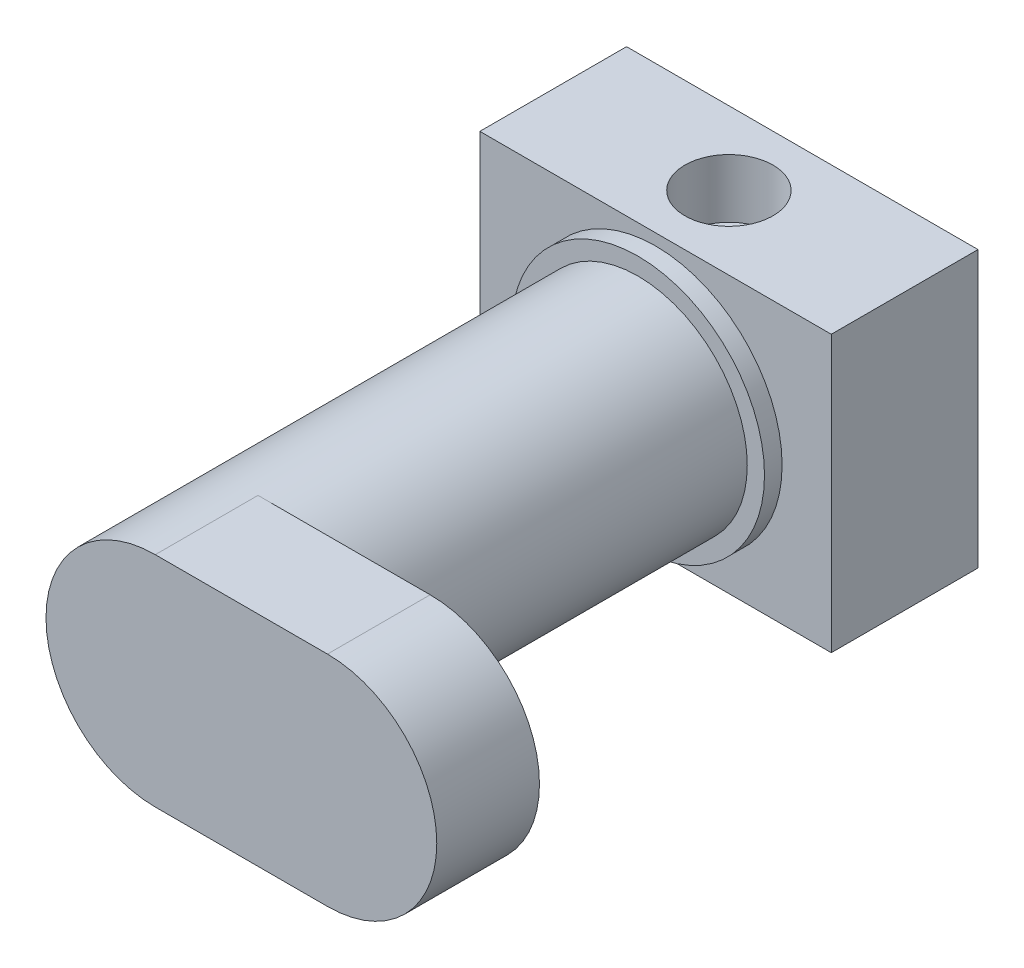
ISO-10303-21;
HEADER;
FILE_DESCRIPTION(('STEP AP214'),'2;1');
FILE_NAME('part.step','',(''),(''),'','','');
FILE_SCHEMA(('AUTOMOTIVE_DESIGN { 1 0 10303 214 1 1 1 1 }'));
ENDSEC;
DATA;
#1=APPLICATION_CONTEXT('core data for automotive mechanical design processes');
#2=APPLICATION_PROTOCOL_DEFINITION('international standard','automotive_design',2000,#1);
#3=PRODUCT_CONTEXT('',#1,'mechanical');
#4=PRODUCT('Part','Part','',(#3));
#5=PRODUCT_RELATED_PRODUCT_CATEGORY('part','',(#4));
#6=PRODUCT_DEFINITION_FORMATION('','',#4);
#7=PRODUCT_DEFINITION_CONTEXT('part definition',#1,'design');
#8=PRODUCT_DEFINITION('design','',#6,#7);
#9=PRODUCT_DEFINITION_SHAPE('','',#8);
#10=(LENGTH_UNIT() NAMED_UNIT(*) SI_UNIT(.MILLI.,.METRE.));
#11=(NAMED_UNIT(*) PLANE_ANGLE_UNIT() SI_UNIT($,.RADIAN.));
#12=(NAMED_UNIT(*) SI_UNIT($,.STERADIAN.) SOLID_ANGLE_UNIT());
#13=UNCERTAINTY_MEASURE_WITH_UNIT(LENGTH_MEASURE(1.E-05),#10,'distance_accuracy_value','');
#14=(GEOMETRIC_REPRESENTATION_CONTEXT(3) GLOBAL_UNCERTAINTY_ASSIGNED_CONTEXT((#13)) GLOBAL_UNIT_ASSIGNED_CONTEXT((#10,
#11,#12)) REPRESENTATION_CONTEXT('',''));
#15=CARTESIAN_POINT('',(0.,0.,0.));
#16=DIRECTION('',(0.,0.,1.));
#17=DIRECTION('',(1.,0.,0.));
#18=AXIS2_PLACEMENT_3D('',#15,#16,#17);
#19=CARTESIAN_POINT('',(0.,0.,22.4));
#20=DIRECTION('',(0.,0.,-1.));
#21=DIRECTION('',(-1.,0.,0.));
#22=AXIS2_PLACEMENT_3D('',#19,#20,#21);
#23=CYLINDRICAL_SURFACE('',#22,17.25);
#24=CARTESIAN_POINT('',(0.,0.,22.4));
#25=DIRECTION('',(0.,0.,1.));
#26=DIRECTION('',(1.,0.,0.));
#27=AXIS2_PLACEMENT_3D('',#24,#25,#26);
#28=CIRCLE('',#27,17.25);
#29=CARTESIAN_POINT('',(17.25,0.,22.4));
#30=VERTEX_POINT('',#29);
#31=EDGE_CURVE('E285',#30,#30,#28,.T.);
#32=ORIENTED_EDGE('',*,*,#31,.F.);
#33=EDGE_LOOP('',(#32));
#34=FACE_BOUND('',#33,.T.);
#35=CARTESIAN_POINT('',(0.,0.,20.));
#36=DIRECTION('',(0.,0.,-1.));
#37=DIRECTION('',(-1.,0.,0.));
#38=AXIS2_PLACEMENT_3D('',#35,#36,#37);
#39=CIRCLE('',#38,17.25);
#40=CARTESIAN_POINT('',(-17.25,0.,20.));
#41=VERTEX_POINT('',#40);
#42=EDGE_CURVE('E11',#41,#41,#39,.T.);
#43=ORIENTED_EDGE('',*,*,#42,.F.);
#44=EDGE_LOOP('',(#43));
#45=FACE_BOUND('',#44,.T.);
#46=ADVANCED_FACE('F37',(#34,#45),#23,.T.);
#47=CARTESIAN_POINT('',(0.,0.,22.4));
#48=DIRECTION('',(0.,0.,1.));
#49=DIRECTION('',(1.,0.,0.));
#50=AXIS2_PLACEMENT_3D('',#47,#48,#49);
#51=PLANE('',#50);
#52=CARTESIAN_POINT('',(0.,0.,22.4));
#53=DIRECTION('',(0.,0.,1.));
#54=DIRECTION('',(1.,0.,0.));
#55=AXIS2_PLACEMENT_3D('',#52,#53,#54);
#56=CIRCLE('',#55,14.9);
#57=CARTESIAN_POINT('',(14.9,0.,22.4));
#58=VERTEX_POINT('',#57);
#59=EDGE_CURVE('E44',#58,#58,#56,.T.);
#60=ORIENTED_EDGE('',*,*,#59,.F.);
#61=EDGE_LOOP('',(#60));
#62=FACE_BOUND('',#61,.T.);
#63=ORIENTED_EDGE('',*,*,#31,.T.);
#64=EDGE_LOOP('',(#63));
#65=FACE_BOUND('',#64,.T.);
#66=ADVANCED_FACE('F290',(#62,#65),#51,.T.);
#67=CARTESIAN_POINT('',(0.,0.,60.8));
#68=DIRECTION('',(0.,0.,-1.));
#69=DIRECTION('',(-1.,0.,0.));
#70=AXIS2_PLACEMENT_3D('',#67,#68,#69);
#71=CYLINDRICAL_SURFACE('',#70,14.9);
#72=ORIENTED_EDGE('',*,*,#59,.T.);
#73=EDGE_LOOP('',(#72));
#74=FACE_BOUND('',#73,.T.);
#75=CARTESIAN_POINT('',(0.,0.,74.2));
#76=DIRECTION('',(0.,0.,1.));
#77=DIRECTION('',(1.,0.,0.));
#78=AXIS2_PLACEMENT_3D('',#75,#76,#77);
#79=CIRCLE('',#78,14.9);
#80=CARTESIAN_POINT('',(0.,-14.9,74.2));
#81=VERTEX_POINT('',#80);
#82=CARTESIAN_POINT('',(0.,14.9,74.2));
#83=VERTEX_POINT('',#82);
#84=EDGE_CURVE('E283',#81,#83,#79,.T.);
#85=ORIENTED_EDGE('',*,*,#84,.F.);
#86=DIRECTION('',(0.,0.,-1.));
#87=VECTOR('',#86,1.);
#88=CARTESIAN_POINT('',(0.,-14.9,88.2));
#89=LINE('',#88,#87);
#90=CARTESIAN_POINT('',(0.,-14.9,88.2));
#91=VERTEX_POINT('',#90);
#92=EDGE_CURVE('E280',#91,#81,#89,.T.);
#93=ORIENTED_EDGE('',*,*,#92,.F.);
#94=CARTESIAN_POINT('',(0.,0.,88.2));
#95=DIRECTION('',(0.,0.,1.));
#96=DIRECTION('',(1.,0.,0.));
#97=AXIS2_PLACEMENT_3D('',#94,#95,#96);
#98=CIRCLE('',#97,14.9);
#99=CARTESIAN_POINT('',(0.,14.9,88.2));
#100=VERTEX_POINT('',#99);
#101=EDGE_CURVE('E256',#100,#91,#98,.T.);
#102=ORIENTED_EDGE('',*,*,#101,.F.);
#103=DIRECTION('',(0.,0.,-1.));
#104=VECTOR('',#103,1.);
#105=CARTESIAN_POINT('',(0.,14.9,88.2));
#106=LINE('',#105,#104);
#107=EDGE_CURVE('E266',#100,#83,#106,.T.);
#108=ORIENTED_EDGE('',*,*,#107,.T.);
#109=EDGE_LOOP('',(#85,#93,#102,#108));
#110=FACE_BOUND('',#109,.T.);
#111=ADVANCED_FACE('F368',(#74,#110),#71,.T.);
#112=CARTESIAN_POINT('',(0.,0.,74.2));
#113=DIRECTION('',(0.,0.,1.));
#114=DIRECTION('',(1.,0.,0.));
#115=AXIS2_PLACEMENT_3D('',#112,#113,#114);
#116=PLANE('',#115);
#117=DIRECTION('',(1.,0.,0.));
#118=VECTOR('',#117,1.);
#119=CARTESIAN_POINT('',(23.4724923544397,-14.9,74.2));
#120=LINE('',#119,#118);
#121=CARTESIAN_POINT('',(23.4724923544397,-14.9,74.2));
#122=VERTEX_POINT('',#121);
#123=EDGE_CURVE('E255',#81,#122,#120,.T.);
#124=ORIENTED_EDGE('',*,*,#123,.F.);
#125=ORIENTED_EDGE('',*,*,#84,.T.);
#126=DIRECTION('',(-1.,0.,0.));
#127=VECTOR('',#126,1.);
#128=CARTESIAN_POINT('',(0.,14.9,74.2));
#129=LINE('',#128,#127);
#130=CARTESIAN_POINT('',(23.4724923544397,14.9,74.2));
#131=VERTEX_POINT('',#130);
#132=EDGE_CURVE('E260',#131,#83,#129,.T.);
#133=ORIENTED_EDGE('',*,*,#132,.F.);
#134=CARTESIAN_POINT('',(23.4724923544397,0.,74.2));
#135=DIRECTION('',(0.,0.,1.));
#136=DIRECTION('',(-1.,0.,0.));
#137=AXIS2_PLACEMENT_3D('',#134,#135,#136);
#138=CIRCLE('',#137,14.9);
#139=EDGE_CURVE('E268',#122,#131,#138,.T.);
#140=ORIENTED_EDGE('',*,*,#139,.F.);
#141=EDGE_LOOP('',(#124,#125,#133,#140));
#142=FACE_BOUND('',#141,.T.);
#143=ADVANCED_FACE('F364',(#142),#116,.F.);
#144=CARTESIAN_POINT('',(23.4724923544397,-14.9,88.2));
#145=DIRECTION('',(0.,1.,0.));
#146=DIRECTION('',(0.,0.,1.));
#147=AXIS2_PLACEMENT_3D('',#144,#145,#146);
#148=PLANE('',#147);
#149=ORIENTED_EDGE('',*,*,#123,.T.);
#150=DIRECTION('',(0.,0.,-1.));
#151=VECTOR('',#150,1.);
#152=CARTESIAN_POINT('',(23.4724923544397,-14.9,88.2));
#153=LINE('',#152,#151);
#154=CARTESIAN_POINT('',(23.4724923544397,-14.9,88.2));
#155=VERTEX_POINT('',#154);
#156=EDGE_CURVE('E277',#155,#122,#153,.T.);
#157=ORIENTED_EDGE('',*,*,#156,.F.);
#158=DIRECTION('',(1.,0.,0.));
#159=VECTOR('',#158,1.);
#160=CARTESIAN_POINT('',(23.4724923544397,-14.9,88.2));
#161=LINE('',#160,#159);
#162=EDGE_CURVE('E259',#91,#155,#161,.T.);
#163=ORIENTED_EDGE('',*,*,#162,.F.);
#164=ORIENTED_EDGE('',*,*,#92,.T.);
#165=EDGE_LOOP('',(#149,#157,#163,#164));
#166=FACE_BOUND('',#165,.T.);
#167=ADVANCED_FACE('F367',(#166),#148,.F.);
#168=CARTESIAN_POINT('',(23.4724923544397,0.,88.2));
#169=DIRECTION('',(0.,0.,-1.));
#170=DIRECTION('',(-1.,0.,0.));
#171=AXIS2_PLACEMENT_3D('',#168,#169,#170);
#172=CYLINDRICAL_SURFACE('',#171,14.9);
#173=ORIENTED_EDGE('',*,*,#139,.T.);
#174=DIRECTION('',(0.,0.,-1.));
#175=VECTOR('',#174,1.);
#176=CARTESIAN_POINT('',(23.4724923544397,14.9,88.2));
#177=LINE('',#176,#175);
#178=CARTESIAN_POINT('',(23.4724923544397,14.9,88.2));
#179=VERTEX_POINT('',#178);
#180=EDGE_CURVE('E274',#179,#131,#177,.T.);
#181=ORIENTED_EDGE('',*,*,#180,.F.);
#182=CARTESIAN_POINT('',(23.4724923544397,0.,88.2));
#183=DIRECTION('',(0.,0.,1.));
#184=DIRECTION('',(-1.,0.,0.));
#185=AXIS2_PLACEMENT_3D('',#182,#183,#184);
#186=CIRCLE('',#185,14.9);
#187=EDGE_CURVE('E262',#155,#179,#186,.T.);
#188=ORIENTED_EDGE('',*,*,#187,.F.);
#189=ORIENTED_EDGE('',*,*,#156,.T.);
#190=EDGE_LOOP('',(#173,#181,#188,#189));
#191=FACE_BOUND('',#190,.T.);
#192=ADVANCED_FACE('F372',(#191),#172,.T.);
#193=CARTESIAN_POINT('',(0.,14.9,88.2));
#194=DIRECTION('',(0.,-1.,0.));
#195=DIRECTION('',(0.,0.,-1.));
#196=AXIS2_PLACEMENT_3D('',#193,#194,#195);
#197=PLANE('',#196);
#198=ORIENTED_EDGE('',*,*,#132,.T.);
#199=ORIENTED_EDGE('',*,*,#107,.F.);
#200=DIRECTION('',(-1.,0.,0.));
#201=VECTOR('',#200,1.);
#202=CARTESIAN_POINT('',(0.,14.9,88.2));
#203=LINE('',#202,#201);
#204=EDGE_CURVE('E264',#179,#100,#203,.T.);
#205=ORIENTED_EDGE('',*,*,#204,.F.);
#206=ORIENTED_EDGE('',*,*,#180,.T.);
#207=EDGE_LOOP('',(#198,#199,#205,#206));
#208=FACE_BOUND('',#207,.T.);
#209=ADVANCED_FACE('F362',(#208),#197,.F.);
#210=CARTESIAN_POINT('',(0.,0.,88.2));
#211=DIRECTION('',(0.,0.,1.));
#212=DIRECTION('',(1.,0.,0.));
#213=AXIS2_PLACEMENT_3D('',#210,#211,#212);
#214=PLANE('',#213);
#215=ORIENTED_EDGE('',*,*,#101,.T.);
#216=ORIENTED_EDGE('',*,*,#162,.T.);
#217=ORIENTED_EDGE('',*,*,#187,.T.);
#218=ORIENTED_EDGE('',*,*,#204,.T.);
#219=EDGE_LOOP('',(#215,#216,#217,#218));
#220=FACE_BOUND('',#219,.T.);
#221=ADVANCED_FACE('F323',(#220),#214,.T.);
#222=CARTESIAN_POINT('',(23.9554551394132,-18.799716307342,20.));
#223=DIRECTION('',(1.,0.,0.));
#224=DIRECTION('',(0.,0.,-1.));
#225=AXIS2_PLACEMENT_3D('',#222,#223,#224);
#226=PLANE('',#225);
#227=DIRECTION('',(0.,-1.,0.));
#228=VECTOR('',#227,1.);
#229=CARTESIAN_POINT('',(23.9554551394132,-18.799716307342,0.));
#230=LINE('',#229,#228);
#231=CARTESIAN_POINT('',(23.9554551394132,18.799716307342,0.));
#232=VERTEX_POINT('',#231);
#233=CARTESIAN_POINT('',(23.9554551394132,-18.799716307342,0.));
#234=VERTEX_POINT('',#233);
#235=EDGE_CURVE('E185',#232,#234,#230,.T.);
#236=ORIENTED_EDGE('',*,*,#235,.F.);
#237=DIRECTION('',(0.,0.,-1.));
#238=VECTOR('',#237,1.);
#239=CARTESIAN_POINT('',(23.9554551394132,18.799716307342,20.));
#240=LINE('',#239,#238);
#241=CARTESIAN_POINT('',(23.9554551394132,18.799716307342,20.));
#242=VERTEX_POINT('',#241);
#243=EDGE_CURVE('E173',#242,#232,#240,.T.);
#244=ORIENTED_EDGE('',*,*,#243,.F.);
#245=DIRECTION('',(0.,-1.,0.));
#246=VECTOR('',#245,1.);
#247=CARTESIAN_POINT('',(23.9554551394132,-18.799716307342,20.));
#248=LINE('',#247,#246);
#249=CARTESIAN_POINT('',(23.9554551394132,-18.799716307342,20.));
#250=VERTEX_POINT('',#249);
#251=EDGE_CURVE('E167',#242,#250,#248,.T.);
#252=ORIENTED_EDGE('',*,*,#251,.T.);
#253=DIRECTION('',(0.,0.,-1.));
#254=VECTOR('',#253,1.);
#255=CARTESIAN_POINT('',(23.9554551394132,-18.799716307342,20.));
#256=LINE('',#255,#254);
#257=EDGE_CURVE('E149',#250,#234,#256,.T.);
#258=ORIENTED_EDGE('',*,*,#257,.T.);
#259=EDGE_LOOP('',(#236,#244,#252,#258));
#260=FACE_BOUND('',#259,.T.);
#261=ADVANCED_FACE('F172',(#260),#226,.T.);
#262=CARTESIAN_POINT('',(-23.9554551394132,18.799716307342,20.));
#263=DIRECTION('',(0.,1.,0.));
#264=DIRECTION('',(-1.,0.,0.));
#265=AXIS2_PLACEMENT_3D('',#262,#263,#264);
#266=PLANE('',#265);
#267=CARTESIAN_POINT('',(0.,18.799716307342,10.));
#268=DIRECTION('',(0.,-1.,0.));
#269=DIRECTION('',(0.,0.,-1.));
#270=AXIS2_PLACEMENT_3D('',#267,#268,#269);
#271=CIRCLE('',#270,6.);
#272=CARTESIAN_POINT('',(0.,18.799716307342,4.));
#273=VERTEX_POINT('',#272);
#274=EDGE_CURVE('E406',#273,#273,#271,.T.);
#275=ORIENTED_EDGE('',*,*,#274,.T.);
#276=EDGE_LOOP('',(#275));
#277=FACE_BOUND('',#276,.T.);
#278=DIRECTION('',(1.,0.,0.));
#279=VECTOR('',#278,1.);
#280=CARTESIAN_POINT('',(-23.9554551394132,18.799716307342,0.));
#281=LINE('',#280,#279);
#282=CARTESIAN_POINT('',(-23.9554551394132,18.799716307342,0.));
#283=VERTEX_POINT('',#282);
#284=EDGE_CURVE('E174',#283,#232,#281,.T.);
#285=ORIENTED_EDGE('',*,*,#284,.F.);
#286=DIRECTION('',(0.,0.,-1.));
#287=VECTOR('',#286,1.);
#288=CARTESIAN_POINT('',(-23.9554551394132,18.799716307342,20.));
#289=LINE('',#288,#287);
#290=CARTESIAN_POINT('',(-23.9554551394132,18.799716307342,20.));
#291=VERTEX_POINT('',#290);
#292=EDGE_CURVE('E192',#291,#283,#289,.T.);
#293=ORIENTED_EDGE('',*,*,#292,.F.);
#294=DIRECTION('',(1.,0.,0.));
#295=VECTOR('',#294,1.);
#296=CARTESIAN_POINT('',(-23.9554551394132,18.799716307342,20.));
#297=LINE('',#296,#295);
#298=EDGE_CURVE('E160',#291,#242,#297,.T.);
#299=ORIENTED_EDGE('',*,*,#298,.T.);
#300=ORIENTED_EDGE('',*,*,#243,.T.);
#301=EDGE_LOOP('',(#285,#293,#299,#300));
#302=FACE_BOUND('',#301,.T.);
#303=ADVANCED_FACE('F315',(#277,#302),#266,.T.);
#304=CARTESIAN_POINT('',(-23.9554551394132,-18.799716307342,20.));
#305=DIRECTION('',(-1.,0.,0.));
#306=DIRECTION('',(0.,0.,1.));
#307=AXIS2_PLACEMENT_3D('',#304,#305,#306);
#308=PLANE('',#307);
#309=DIRECTION('',(0.,1.,0.));
#310=VECTOR('',#309,1.);
#311=CARTESIAN_POINT('',(-23.9554551394132,-18.799716307342,0.));
#312=LINE('',#311,#310);
#313=CARTESIAN_POINT('',(-23.9554551394132,-18.799716307342,0.));
#314=VERTEX_POINT('',#313);
#315=EDGE_CURVE('E177',#314,#283,#312,.T.);
#316=ORIENTED_EDGE('',*,*,#315,.F.);
#317=DIRECTION('',(0.,0.,-1.));
#318=VECTOR('',#317,1.);
#319=CARTESIAN_POINT('',(-23.9554551394132,-18.799716307342,20.));
#320=LINE('',#319,#318);
#321=CARTESIAN_POINT('',(-23.9554551394132,-18.799716307342,20.));
#322=VERTEX_POINT('',#321);
#323=EDGE_CURVE('E159',#322,#314,#320,.T.);
#324=ORIENTED_EDGE('',*,*,#323,.F.);
#325=DIRECTION('',(0.,1.,0.));
#326=VECTOR('',#325,1.);
#327=CARTESIAN_POINT('',(-23.9554551394132,-18.799716307342,20.));
#328=LINE('',#327,#326);
#329=EDGE_CURVE('E170',#322,#291,#328,.T.);
#330=ORIENTED_EDGE('',*,*,#329,.T.);
#331=ORIENTED_EDGE('',*,*,#292,.T.);
#332=EDGE_LOOP('',(#316,#324,#330,#331));
#333=FACE_BOUND('',#332,.T.);
#334=ADVANCED_FACE('F308',(#333),#308,.T.);
#335=CARTESIAN_POINT('',(-23.9554551394132,-18.799716307342,20.));
#336=DIRECTION('',(0.,-1.,0.));
#337=DIRECTION('',(0.,0.,-1.));
#338=AXIS2_PLACEMENT_3D('',#335,#336,#337);
#339=PLANE('',#338);
#340=CARTESIAN_POINT('',(0.,-18.799716307342,10.));
#341=DIRECTION('',(0.,-1.,0.));
#342=DIRECTION('',(0.,0.,-1.));
#343=AXIS2_PLACEMENT_3D('',#340,#341,#342);
#344=CIRCLE('',#343,6.);
#345=CARTESIAN_POINT('',(0.,-18.799716307342,4.));
#346=VERTEX_POINT('',#345);
#347=EDGE_CURVE('E180',#346,#346,#344,.T.);
#348=ORIENTED_EDGE('',*,*,#347,.F.);
#349=EDGE_LOOP('',(#348));
#350=FACE_BOUND('',#349,.T.);
#351=DIRECTION('',(-1.,0.,0.));
#352=VECTOR('',#351,1.);
#353=CARTESIAN_POINT('',(-23.9554551394132,-18.799716307342,0.));
#354=LINE('',#353,#352);
#355=EDGE_CURVE('E154',#234,#314,#354,.T.);
#356=ORIENTED_EDGE('',*,*,#355,.F.);
#357=ORIENTED_EDGE('',*,*,#257,.F.);
#358=DIRECTION('',(-1.,0.,0.));
#359=VECTOR('',#358,1.);
#360=CARTESIAN_POINT('',(-23.9554551394132,-18.799716307342,20.));
#361=LINE('',#360,#359);
#362=EDGE_CURVE('E152',#250,#322,#361,.T.);
#363=ORIENTED_EDGE('',*,*,#362,.T.);
#364=ORIENTED_EDGE('',*,*,#323,.T.);
#365=EDGE_LOOP('',(#356,#357,#363,#364));
#366=FACE_BOUND('',#365,.T.);
#367=ADVANCED_FACE('F151',(#350,#366),#339,.T.);
#368=CARTESIAN_POINT('',(0.,0.,20.));
#369=DIRECTION('',(0.,0.,-1.));
#370=DIRECTION('',(-1.,0.,0.));
#371=AXIS2_PLACEMENT_3D('',#368,#369,#370);
#372=PLANE('',#371);
#373=ORIENTED_EDGE('',*,*,#42,.T.);
#374=EDGE_LOOP('',(#373));
#375=FACE_BOUND('',#374,.T.);
#376=ORIENTED_EDGE('',*,*,#251,.F.);
#377=ORIENTED_EDGE('',*,*,#298,.F.);
#378=ORIENTED_EDGE('',*,*,#329,.F.);
#379=ORIENTED_EDGE('',*,*,#362,.F.);
#380=EDGE_LOOP('',(#376,#377,#378,#379));
#381=FACE_BOUND('',#380,.T.);
#382=ADVANCED_FACE('F165',(#375,#381),#372,.F.);
#383=CARTESIAN_POINT('',(0.,0.,-8.));
#384=DIRECTION('',(0.,0.,-1.));
#385=DIRECTION('',(-1.,0.,0.));
#386=AXIS2_PLACEMENT_3D('',#383,#384,#385);
#387=PLANE('',#386);
#388=DIRECTION('',(0.,-1.,0.));
#389=VECTOR('',#388,1.);
#390=CARTESIAN_POINT('',(1.5,-5.,-8.));
#391=LINE('',#390,#389);
#392=CARTESIAN_POINT('',(1.5,5.,-8.));
#393=VERTEX_POINT('',#392);
#394=CARTESIAN_POINT('',(1.5,-5.,-8.));
#395=VERTEX_POINT('',#394);
#396=EDGE_CURVE('E195',#393,#395,#391,.T.);
#397=ORIENTED_EDGE('',*,*,#396,.T.);
#398=DIRECTION('',(-1.,0.,0.));
#399=VECTOR('',#398,1.);
#400=CARTESIAN_POINT('',(-1.5,-5.,-8.));
#401=LINE('',#400,#399);
#402=CARTESIAN_POINT('',(-1.5,-5.,-8.));
#403=VERTEX_POINT('',#402);
#404=EDGE_CURVE('E198',#395,#403,#401,.T.);
#405=ORIENTED_EDGE('',*,*,#404,.T.);
#406=DIRECTION('',(0.,1.,0.));
#407=VECTOR('',#406,1.);
#408=CARTESIAN_POINT('',(-1.5,-5.,-8.));
#409=LINE('',#408,#407);
#410=CARTESIAN_POINT('',(-1.5,5.,-8.));
#411=VERTEX_POINT('',#410);
#412=EDGE_CURVE('E202',#403,#411,#409,.T.);
#413=ORIENTED_EDGE('',*,*,#412,.T.);
#414=DIRECTION('',(1.,0.,0.));
#415=VECTOR('',#414,1.);
#416=CARTESIAN_POINT('',(-1.5,5.,-8.));
#417=LINE('',#416,#415);
#418=EDGE_CURVE('E205',#411,#393,#417,.T.);
#419=ORIENTED_EDGE('',*,*,#418,.T.);
#420=EDGE_LOOP('',(#397,#405,#413,#419));
#421=FACE_BOUND('',#420,.T.);
#422=ADVANCED_FACE('F297',(#421),#387,.T.);
#423=CARTESIAN_POINT('',(-1.5,-5.,-8.));
#424=DIRECTION('',(0.,-1.,0.));
#425=DIRECTION('',(0.,0.,-1.));
#426=AXIS2_PLACEMENT_3D('',#423,#424,#425);
#427=PLANE('',#426);
#428=DIRECTION('',(-1.,0.,0.));
#429=VECTOR('',#428,1.);
#430=CARTESIAN_POINT('',(-1.5,-5.,-10.));
#431=LINE('',#430,#429);
#432=CARTESIAN_POINT('',(1.5,-5.,-10.));
#433=VERTEX_POINT('',#432);
#434=CARTESIAN_POINT('',(-1.5,-5.,-10.));
#435=VERTEX_POINT('',#434);
#436=EDGE_CURVE('E210',#433,#435,#431,.T.);
#437=ORIENTED_EDGE('',*,*,#436,.T.);
#438=DIRECTION('',(0.,0.,-1.));
#439=VECTOR('',#438,1.);
#440=CARTESIAN_POINT('',(-1.5,-5.,-8.));
#441=LINE('',#440,#439);
#442=EDGE_CURVE('E222',#403,#435,#441,.T.);
#443=ORIENTED_EDGE('',*,*,#442,.F.);
#444=ORIENTED_EDGE('',*,*,#404,.F.);
#445=DIRECTION('',(0.,0.,-1.));
#446=VECTOR('',#445,1.);
#447=CARTESIAN_POINT('',(1.5,-5.,-8.));
#448=LINE('',#447,#446);
#449=EDGE_CURVE('E208',#395,#433,#448,.T.);
#450=ORIENTED_EDGE('',*,*,#449,.T.);
#451=EDGE_LOOP('',(#437,#443,#444,#450));
#452=FACE_BOUND('',#451,.T.);
#453=ADVANCED_FACE('F304',(#452),#427,.F.);
#454=CARTESIAN_POINT('',(-1.5,-5.,-8.));
#455=DIRECTION('',(-1.,0.,0.));
#456=DIRECTION('',(0.,0.,1.));
#457=AXIS2_PLACEMENT_3D('',#454,#455,#456);
#458=PLANE('',#457);
#459=DIRECTION('',(0.,1.,0.));
#460=VECTOR('',#459,1.);
#461=CARTESIAN_POINT('',(-1.5,-5.,-10.));
#462=LINE('',#461,#460);
#463=CARTESIAN_POINT('',(-1.5,5.,-10.));
#464=VERTEX_POINT('',#463);
#465=EDGE_CURVE('E213',#435,#464,#462,.T.);
#466=ORIENTED_EDGE('',*,*,#465,.T.);
#467=DIRECTION('',(0.,0.,-1.));
#468=VECTOR('',#467,1.);
#469=CARTESIAN_POINT('',(-1.5,5.,-8.));
#470=LINE('',#469,#468);
#471=EDGE_CURVE('E220',#411,#464,#470,.T.);
#472=ORIENTED_EDGE('',*,*,#471,.F.);
#473=ORIENTED_EDGE('',*,*,#412,.F.);
#474=ORIENTED_EDGE('',*,*,#442,.T.);
#475=EDGE_LOOP('',(#466,#472,#473,#474));
#476=FACE_BOUND('',#475,.T.);
#477=ADVANCED_FACE('F329',(#476),#458,.F.);
#478=CARTESIAN_POINT('',(-1.5,5.,-8.));
#479=DIRECTION('',(0.,1.,0.));
#480=DIRECTION('',(0.,0.,1.));
#481=AXIS2_PLACEMENT_3D('',#478,#479,#480);
#482=PLANE('',#481);
#483=DIRECTION('',(1.,0.,0.));
#484=VECTOR('',#483,1.);
#485=CARTESIAN_POINT('',(-1.5,5.,-10.));
#486=LINE('',#485,#484);
#487=CARTESIAN_POINT('',(1.5,5.,-10.));
#488=VERTEX_POINT('',#487);
#489=EDGE_CURVE('E199',#464,#488,#486,.T.);
#490=ORIENTED_EDGE('',*,*,#489,.T.);
#491=DIRECTION('',(0.,0.,-1.));
#492=VECTOR('',#491,1.);
#493=CARTESIAN_POINT('',(1.5,5.,-8.));
#494=LINE('',#493,#492);
#495=EDGE_CURVE('E218',#393,#488,#494,.T.);
#496=ORIENTED_EDGE('',*,*,#495,.F.);
#497=ORIENTED_EDGE('',*,*,#418,.F.);
#498=ORIENTED_EDGE('',*,*,#471,.T.);
#499=EDGE_LOOP('',(#490,#496,#497,#498));
#500=FACE_BOUND('',#499,.T.);
#501=ADVANCED_FACE('F325',(#500),#482,.F.);
#502=CARTESIAN_POINT('',(1.5,-5.,-8.));
#503=DIRECTION('',(1.,0.,0.));
#504=DIRECTION('',(0.,1.,0.));
#505=AXIS2_PLACEMENT_3D('',#502,#503,#504);
#506=PLANE('',#505);
#507=DIRECTION('',(0.,-1.,0.));
#508=VECTOR('',#507,1.);
#509=CARTESIAN_POINT('',(1.5,-5.,-10.));
#510=LINE('',#509,#508);
#511=EDGE_CURVE('E51',#488,#433,#510,.T.);
#512=ORIENTED_EDGE('',*,*,#511,.T.);
#513=ORIENTED_EDGE('',*,*,#449,.F.);
#514=ORIENTED_EDGE('',*,*,#396,.F.);
#515=ORIENTED_EDGE('',*,*,#495,.T.);
#516=EDGE_LOOP('',(#512,#513,#514,#515));
#517=FACE_BOUND('',#516,.T.);
#518=ADVANCED_FACE('F328',(#517),#506,.F.);
#519=CARTESIAN_POINT('',(0.,0.,-10.));
#520=DIRECTION('',(0.,0.,-1.));
#521=DIRECTION('',(-1.,0.,0.));
#522=AXIS2_PLACEMENT_3D('',#519,#520,#521);
#523=PLANE('',#522);
#524=ORIENTED_EDGE('',*,*,#511,.F.);
#525=ORIENTED_EDGE('',*,*,#489,.F.);
#526=ORIENTED_EDGE('',*,*,#465,.F.);
#527=ORIENTED_EDGE('',*,*,#436,.F.);
#528=EDGE_LOOP('',(#524,#525,#526,#527));
#529=FACE_BOUND('',#528,.T.);
#530=DIRECTION('',(0.,-1.,0.));
#531=VECTOR('',#530,1.);
#532=CARTESIAN_POINT('',(4.,-6.,-10.));
#533=LINE('',#532,#531);
#534=CARTESIAN_POINT('',(4.,6.,-10.));
#535=VERTEX_POINT('',#534);
#536=CARTESIAN_POINT('',(4.,-6.,-10.));
#537=VERTEX_POINT('',#536);
#538=EDGE_CURVE('E225',#535,#537,#533,.T.);
#539=ORIENTED_EDGE('',*,*,#538,.T.);
#540=DIRECTION('',(-1.,0.,0.));
#541=VECTOR('',#540,1.);
#542=CARTESIAN_POINT('',(-4.,-6.,-10.));
#543=LINE('',#542,#541);
#544=CARTESIAN_POINT('',(-4.,-6.,-10.));
#545=VERTEX_POINT('',#544);
#546=EDGE_CURVE('E228',#537,#545,#543,.T.);
#547=ORIENTED_EDGE('',*,*,#546,.T.);
#548=DIRECTION('',(0.,1.,0.));
#549=VECTOR('',#548,1.);
#550=CARTESIAN_POINT('',(-4.,-6.,-10.));
#551=LINE('',#550,#549);
#552=CARTESIAN_POINT('',(-4.,6.,-10.));
#553=VERTEX_POINT('',#552);
#554=EDGE_CURVE('E231',#545,#553,#551,.T.);
#555=ORIENTED_EDGE('',*,*,#554,.T.);
#556=DIRECTION('',(1.,0.,0.));
#557=VECTOR('',#556,1.);
#558=CARTESIAN_POINT('',(-4.,6.,-10.));
#559=LINE('',#558,#557);
#560=EDGE_CURVE('E233',#553,#535,#559,.T.);
#561=ORIENTED_EDGE('',*,*,#560,.T.);
#562=EDGE_LOOP('',(#539,#547,#555,#561));
#563=FACE_BOUND('',#562,.T.);
#564=ADVANCED_FACE('F339',(#529,#563),#523,.T.);
#565=CARTESIAN_POINT('',(-4.,-6.,-10.));
#566=DIRECTION('',(0.,1.,0.));
#567=DIRECTION('',(-1.,0.,0.));
#568=AXIS2_PLACEMENT_3D('',#565,#566,#567);
#569=PLANE('',#568);
#570=DIRECTION('',(-1.,0.,0.));
#571=VECTOR('',#570,1.);
#572=CARTESIAN_POINT('',(-4.,-6.,0.));
#573=LINE('',#572,#571);
#574=CARTESIAN_POINT('',(4.,-6.,0.));
#575=VERTEX_POINT('',#574);
#576=CARTESIAN_POINT('',(-4.,-6.,0.));
#577=VERTEX_POINT('',#576);
#578=EDGE_CURVE('E237',#575,#577,#573,.T.);
#579=ORIENTED_EDGE('',*,*,#578,.T.);
#580=DIRECTION('',(0.,0.,1.));
#581=VECTOR('',#580,1.);
#582=CARTESIAN_POINT('',(-4.,-6.,-10.));
#583=LINE('',#582,#581);
#584=EDGE_CURVE('E249',#545,#577,#583,.T.);
#585=ORIENTED_EDGE('',*,*,#584,.F.);
#586=ORIENTED_EDGE('',*,*,#546,.F.);
#587=DIRECTION('',(0.,0.,1.));
#588=VECTOR('',#587,1.);
#589=CARTESIAN_POINT('',(4.,-6.,-10.));
#590=LINE('',#589,#588);
#591=EDGE_CURVE('E252',#537,#575,#590,.T.);
#592=ORIENTED_EDGE('',*,*,#591,.T.);
#593=EDGE_LOOP('',(#579,#585,#586,#592));
#594=FACE_BOUND('',#593,.T.);
#595=ADVANCED_FACE('F342',(#594),#569,.F.);
#596=CARTESIAN_POINT('',(-4.,-6.,-10.));
#597=DIRECTION('',(1.,0.,0.));
#598=DIRECTION('',(0.,0.,-1.));
#599=AXIS2_PLACEMENT_3D('',#596,#597,#598);
#600=PLANE('',#599);
#601=DIRECTION('',(0.,1.,0.));
#602=VECTOR('',#601,1.);
#603=CARTESIAN_POINT('',(-4.,-6.,0.));
#604=LINE('',#603,#602);
#605=CARTESIAN_POINT('',(-4.,6.,0.));
#606=VERTEX_POINT('',#605);
#607=EDGE_CURVE('E240',#577,#606,#604,.T.);
#608=ORIENTED_EDGE('',*,*,#607,.T.);
#609=DIRECTION('',(0.,0.,1.));
#610=VECTOR('',#609,1.);
#611=CARTESIAN_POINT('',(-4.,6.,-10.));
#612=LINE('',#611,#610);
#613=EDGE_CURVE('E246',#553,#606,#612,.T.);
#614=ORIENTED_EDGE('',*,*,#613,.F.);
#615=ORIENTED_EDGE('',*,*,#554,.F.);
#616=ORIENTED_EDGE('',*,*,#584,.T.);
#617=EDGE_LOOP('',(#608,#614,#615,#616));
#618=FACE_BOUND('',#617,.T.);
#619=ADVANCED_FACE('F348',(#618),#600,.F.);
#620=CARTESIAN_POINT('',(-4.,6.,-10.));
#621=DIRECTION('',(0.,-1.,0.));
#622=DIRECTION('',(0.,0.,-1.));
#623=AXIS2_PLACEMENT_3D('',#620,#621,#622);
#624=PLANE('',#623);
#625=DIRECTION('',(1.,0.,0.));
#626=VECTOR('',#625,1.);
#627=CARTESIAN_POINT('',(-4.,6.,0.));
#628=LINE('',#627,#626);
#629=CARTESIAN_POINT('',(4.,6.,0.));
#630=VERTEX_POINT('',#629);
#631=EDGE_CURVE('E229',#606,#630,#628,.T.);
#632=ORIENTED_EDGE('',*,*,#631,.T.);
#633=DIRECTION('',(0.,0.,1.));
#634=VECTOR('',#633,1.);
#635=CARTESIAN_POINT('',(4.,6.,-10.));
#636=LINE('',#635,#634);
#637=EDGE_CURVE('E235',#535,#630,#636,.T.);
#638=ORIENTED_EDGE('',*,*,#637,.F.);
#639=ORIENTED_EDGE('',*,*,#560,.F.);
#640=ORIENTED_EDGE('',*,*,#613,.T.);
#641=EDGE_LOOP('',(#632,#638,#639,#640));
#642=FACE_BOUND('',#641,.T.);
#643=ADVANCED_FACE('F344',(#642),#624,.F.);
#644=CARTESIAN_POINT('',(4.,-6.,-10.));
#645=DIRECTION('',(-1.,0.,0.));
#646=DIRECTION('',(0.,0.,1.));
#647=AXIS2_PLACEMENT_3D('',#644,#645,#646);
#648=PLANE('',#647);
#649=DIRECTION('',(0.,-1.,0.));
#650=VECTOR('',#649,1.);
#651=CARTESIAN_POINT('',(4.,-6.,0.));
#652=LINE('',#651,#650);
#653=EDGE_CURVE('E59',#630,#575,#652,.T.);
#654=ORIENTED_EDGE('',*,*,#653,.T.);
#655=ORIENTED_EDGE('',*,*,#591,.F.);
#656=ORIENTED_EDGE('',*,*,#538,.F.);
#657=ORIENTED_EDGE('',*,*,#637,.T.);
#658=EDGE_LOOP('',(#654,#655,#656,#657));
#659=FACE_BOUND('',#658,.T.);
#660=ADVANCED_FACE('F347',(#659),#648,.F.);
#661=CARTESIAN_POINT('',(0.,0.,0.));
#662=DIRECTION('',(0.,0.,1.));
#663=DIRECTION('',(1.,0.,0.));
#664=AXIS2_PLACEMENT_3D('',#661,#662,#663);
#665=PLANE('',#664);
#666=ORIENTED_EDGE('',*,*,#653,.F.);
#667=ORIENTED_EDGE('',*,*,#631,.F.);
#668=ORIENTED_EDGE('',*,*,#607,.F.);
#669=ORIENTED_EDGE('',*,*,#578,.F.);
#670=EDGE_LOOP('',(#666,#667,#668,#669));
#671=FACE_BOUND('',#670,.T.);
#672=ORIENTED_EDGE('',*,*,#235,.T.);
#673=ORIENTED_EDGE('',*,*,#355,.T.);
#674=ORIENTED_EDGE('',*,*,#315,.T.);
#675=ORIENTED_EDGE('',*,*,#284,.T.);
#676=EDGE_LOOP('',(#672,#673,#674,#675));
#677=FACE_BOUND('',#676,.T.);
#678=ADVANCED_FACE('F358',(#671,#677),#665,.F.);
#679=CARTESIAN_POINT('',(0.,-10.799716307342,10.));
#680=DIRECTION('',(0.,-1.,0.));
#681=DIRECTION('',(0.,0.,-1.));
#682=AXIS2_PLACEMENT_3D('',#679,#680,#681);
#683=CYLINDRICAL_SURFACE('',#682,6.);
#684=CARTESIAN_POINT('',(0.,-10.799716307342,10.));
#685=DIRECTION('',(0.,-1.,0.));
#686=DIRECTION('',(0.,0.,-1.));
#687=AXIS2_PLACEMENT_3D('',#684,#685,#686);
#688=CIRCLE('',#687,6.);
#689=CARTESIAN_POINT('',(0.,-10.799716307342,4.));
#690=VERTEX_POINT('',#689);
#691=EDGE_CURVE('E187',#690,#690,#688,.T.);
#692=ORIENTED_EDGE('',*,*,#691,.F.);
#693=EDGE_LOOP('',(#692));
#694=FACE_BOUND('',#693,.T.);
#695=ORIENTED_EDGE('',*,*,#347,.T.);
#696=EDGE_LOOP('',(#695));
#697=FACE_BOUND('',#696,.T.);
#698=ADVANCED_FACE('F313',(#694,#697),#683,.F.);
#699=CARTESIAN_POINT('',(0.,-10.799716307342,10.));
#700=DIRECTION('',(0.,-1.,0.));
#701=DIRECTION('',(0.,0.,-1.));
#702=AXIS2_PLACEMENT_3D('',#699,#700,#701);
#703=PLANE('',#702);
#704=ORIENTED_EDGE('',*,*,#691,.T.);
#705=EDGE_LOOP('',(#704));
#706=FACE_BOUND('',#705,.T.);
#707=ADVANCED_FACE('F388',(#706),#703,.T.);
#708=CARTESIAN_POINT('',(0.,10.799716307342,10.));
#709=DIRECTION('',(0.,1.,0.));
#710=DIRECTION('',(-1.,0.,0.));
#711=AXIS2_PLACEMENT_3D('',#708,#709,#710);
#712=CYLINDRICAL_SURFACE('',#711,6.);
#713=CARTESIAN_POINT('',(0.,10.799716307342,10.));
#714=DIRECTION('',(0.,-1.,0.));
#715=DIRECTION('',(0.,0.,-1.));
#716=AXIS2_PLACEMENT_3D('',#713,#714,#715);
#717=CIRCLE('',#716,6.);
#718=CARTESIAN_POINT('',(0.,10.799716307342,4.));
#719=VERTEX_POINT('',#718);
#720=EDGE_CURVE('E404',#719,#719,#717,.T.);
#721=ORIENTED_EDGE('',*,*,#720,.T.);
#722=EDGE_LOOP('',(#721));
#723=FACE_BOUND('',#722,.T.);
#724=ORIENTED_EDGE('',*,*,#274,.F.);
#725=EDGE_LOOP('',(#724));
#726=FACE_BOUND('',#725,.T.);
#727=ADVANCED_FACE('F397',(#723,#726),#712,.F.);
#728=CARTESIAN_POINT('',(0.,10.799716307342,10.));
#729=DIRECTION('',(0.,1.,0.));
#730=DIRECTION('',(0.,0.,-1.));
#731=AXIS2_PLACEMENT_3D('',#728,#729,#730);
#732=PLANE('',#731);
#733=ORIENTED_EDGE('',*,*,#720,.F.);
#734=EDGE_LOOP('',(#733));
#735=FACE_BOUND('',#734,.T.);
#736=ADVANCED_FACE('F415',(#735),#732,.T.);
#737=CLOSED_SHELL('',(#46,#66,#111,#143,#167,#192,#209,#221,#261,#303,#334,#367,#382,#422,#453,
#477,#501,#518,#564,#595,#619,#643,#660,#678,#698,#707,#727,#736));
#738=MANIFOLD_SOLID_BREP('B2',#737);
#739=ADVANCED_BREP_SHAPE_REPRESENTATION('',(#18,#738),#14);
#740=SHAPE_DEFINITION_REPRESENTATION(#9,#739);
ENDSEC;
END-ISO-10303-21;
